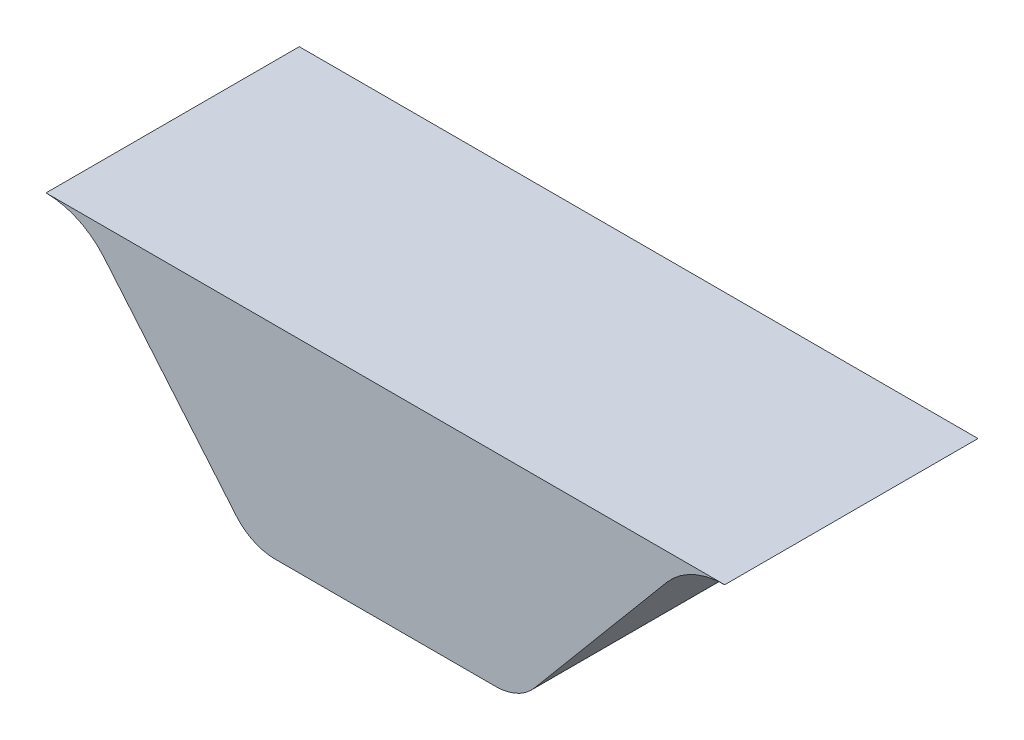
ISO-10303-21;
HEADER;
FILE_DESCRIPTION(('STEP AP214'),'2;1');
FILE_NAME('part.step','',(''),(''),'','','');
FILE_SCHEMA(('AUTOMOTIVE_DESIGN { 1 0 10303 214 1 1 1 1 }'));
ENDSEC;
DATA;
#1=APPLICATION_CONTEXT('core data for automotive mechanical design processes');
#2=APPLICATION_PROTOCOL_DEFINITION('international standard','automotive_design',2000,#1);
#3=PRODUCT_CONTEXT('',#1,'mechanical');
#4=PRODUCT('Part','Part','',(#3));
#5=PRODUCT_RELATED_PRODUCT_CATEGORY('part','',(#4));
#6=PRODUCT_DEFINITION_FORMATION('','',#4);
#7=PRODUCT_DEFINITION_CONTEXT('part definition',#1,'design');
#8=PRODUCT_DEFINITION('design','',#6,#7);
#9=PRODUCT_DEFINITION_SHAPE('','',#8);
#10=(LENGTH_UNIT() NAMED_UNIT(*) SI_UNIT(.MILLI.,.METRE.));
#11=(NAMED_UNIT(*) PLANE_ANGLE_UNIT() SI_UNIT($,.RADIAN.));
#12=(NAMED_UNIT(*) SI_UNIT($,.STERADIAN.) SOLID_ANGLE_UNIT());
#13=UNCERTAINTY_MEASURE_WITH_UNIT(LENGTH_MEASURE(1.E-05),#10,'distance_accuracy_value','');
#14=(GEOMETRIC_REPRESENTATION_CONTEXT(3) GLOBAL_UNCERTAINTY_ASSIGNED_CONTEXT((#13)) GLOBAL_UNIT_ASSIGNED_CONTEXT((#10,
#11,#12)) REPRESENTATION_CONTEXT('',''));
#15=CARTESIAN_POINT('',(0.,0.,0.));
#16=DIRECTION('',(0.,0.,1.));
#17=DIRECTION('',(1.,0.,0.));
#18=AXIS2_PLACEMENT_3D('',#15,#16,#17);
#19=CARTESIAN_POINT('',(2.64360147529084,-4.,2.5));
#20=DIRECTION('',(0.,1.,0.));
#21=DIRECTION('',(0.,0.,1.));
#22=AXIS2_PLACEMENT_3D('',#19,#20,#21);
#23=PLANE('',#22);
#24=DIRECTION('',(1.,0.,0.));
#25=VECTOR('',#24,1.);
#26=CARTESIAN_POINT('',(2.64360147529084,-4.,2.5));
#27=LINE('',#26,#25);
#28=CARTESIAN_POINT('',(-2.17729381713585,-4.,2.5));
#29=VERTEX_POINT('',#28);
#30=CARTESIAN_POINT('',(2.17729381713585,-4.,2.5));
#31=VERTEX_POINT('',#30);
#32=EDGE_CURVE('E169',#29,#31,#27,.T.);
#33=ORIENTED_EDGE('',*,*,#32,.F.);
#34=DIRECTION('',(0.,0.,-1.));
#35=VECTOR('',#34,1.);
#36=CARTESIAN_POINT('',(-2.17729381713585,-4.,2.5));
#37=LINE('',#36,#35);
#38=CARTESIAN_POINT('',(-2.17729381713585,-4.,-2.5));
#39=VERTEX_POINT('',#38);
#40=EDGE_CURVE('E155',#29,#39,#37,.T.);
#41=ORIENTED_EDGE('',*,*,#40,.T.);
#42=DIRECTION('',(1.,0.,0.));
#43=VECTOR('',#42,1.);
#44=CARTESIAN_POINT('',(2.64360147529084,-4.,-2.5));
#45=LINE('',#44,#43);
#46=CARTESIAN_POINT('',(2.17729381713585,-4.,-2.5));
#47=VERTEX_POINT('',#46);
#48=EDGE_CURVE('E161',#39,#47,#45,.T.);
#49=ORIENTED_EDGE('',*,*,#48,.T.);
#50=DIRECTION('',(0.,0.,-1.));
#51=VECTOR('',#50,1.);
#52=CARTESIAN_POINT('',(2.17729381713585,-4.,2.5));
#53=LINE('',#52,#51);
#54=EDGE_CURVE('E158',#47,#31,#53,.F.);
#55=ORIENTED_EDGE('',*,*,#54,.T.);
#56=EDGE_LOOP('',(#33,#41,#49,#55));
#57=FACE_BOUND('',#56,.T.);
#58=CARTESIAN_POINT('',(0.,-4.,0.));
#59=DIRECTION('',(0.,1.,0.));
#60=DIRECTION('',(0.,0.,1.));
#61=AXIS2_PLACEMENT_3D('',#58,#59,#60);
#62=CIRCLE('',#61,1.5);
#63=CARTESIAN_POINT('',(0.,-4.,1.5));
#64=VERTEX_POINT('',#63);
#65=EDGE_CURVE('E12',#64,#64,#62,.F.);
#66=ORIENTED_EDGE('',*,*,#65,.F.);
#67=EDGE_LOOP('',(#66));
#68=FACE_BOUND('',#67,.T.);
#69=ADVANCED_FACE('F43',(#57,#68),#23,.F.);
#70=CARTESIAN_POINT('',(-2.64360147529084,-4.,2.5));
#71=DIRECTION('',(0.766044443118974,0.642787609686544,0.));
#72=DIRECTION('',(-0.642787609686544,0.766044443118974,0.));
#73=AXIS2_PLACEMENT_3D('',#70,#71,#72);
#74=PLANE('',#73);
#75=DIRECTION('',(0.642787609686544,-0.766044443118974,0.));
#76=VECTOR('',#75,1.);
#77=CARTESIAN_POINT('',(-2.64360147529084,-4.,2.5));
#78=LINE('',#77,#76);
#79=CARTESIAN_POINT('',(-5.55039482255403,-0.535818585470184,2.5));
#80=VERTEX_POINT('',#79);
#81=CARTESIAN_POINT('',(-2.94333826025482,-3.64278760968654,2.5));
#82=VERTEX_POINT('',#81);
#83=EDGE_CURVE('E128',#80,#82,#78,.T.);
#84=ORIENTED_EDGE('',*,*,#83,.F.);
#85=DIRECTION('',(0.,0.,-1.));
#86=VECTOR('',#85,1.);
#87=CARTESIAN_POINT('',(-5.55039482255403,-0.535818585470185,-2.5));
#88=LINE('',#87,#86);
#89=CARTESIAN_POINT('',(-5.55039482255403,-0.535818585470184,-2.5));
#90=VERTEX_POINT('',#89);
#91=EDGE_CURVE('E121',#80,#90,#88,.T.);
#92=ORIENTED_EDGE('',*,*,#91,.T.);
#93=DIRECTION('',(0.642787609686544,-0.766044443118974,0.));
#94=VECTOR('',#93,1.);
#95=CARTESIAN_POINT('',(-2.64360147529084,-4.,-2.5));
#96=LINE('',#95,#94);
#97=CARTESIAN_POINT('',(-2.94333826025482,-3.64278760968654,-2.5));
#98=VERTEX_POINT('',#97);
#99=EDGE_CURVE('E164',#90,#98,#96,.T.);
#100=ORIENTED_EDGE('',*,*,#99,.T.);
#101=DIRECTION('',(0.,0.,-1.));
#102=VECTOR('',#101,1.);
#103=CARTESIAN_POINT('',(-2.94333826025482,-3.64278760968654,2.5));
#104=LINE('',#103,#102);
#105=EDGE_CURVE('E147',#98,#82,#104,.F.);
#106=ORIENTED_EDGE('',*,*,#105,.T.);
#107=EDGE_LOOP('',(#84,#92,#100,#106));
#108=FACE_BOUND('',#107,.T.);
#109=ADVANCED_FACE('F181',(#108),#74,.F.);
#110=ORIENTED_EDGE('',*,*,#65,.T.);
#111=EDGE_LOOP('',(#110));
#112=FACE_BOUND('',#111,.T.);
#113=ADVANCED_FACE('F203',(#112),#23,.F.);
#114=CARTESIAN_POINT('',(6.,0.,2.5));
#115=DIRECTION('',(-0.766044443118975,0.642787609686543,0.));
#116=DIRECTION('',(-0.642787609686543,-0.766044443118975,0.));
#117=AXIS2_PLACEMENT_3D('',#114,#115,#116);
#118=PLANE('',#117);
#119=DIRECTION('',(0.642787609686543,0.766044443118975,0.));
#120=VECTOR('',#119,1.);
#121=CARTESIAN_POINT('',(6.,0.,-2.5));
#122=LINE('',#121,#120);
#123=CARTESIAN_POINT('',(2.94333826025482,-3.64278760968654,-2.5));
#124=VERTEX_POINT('',#123);
#125=CARTESIAN_POINT('',(5.55039482255403,-0.535818585470184,-2.5));
#126=VERTEX_POINT('',#125);
#127=EDGE_CURVE('E129',#124,#126,#122,.T.);
#128=ORIENTED_EDGE('',*,*,#127,.T.);
#129=DIRECTION('',(0.,0.,-1.));
#130=VECTOR('',#129,1.);
#131=CARTESIAN_POINT('',(5.55039482255403,-0.535818585470184,2.5));
#132=LINE('',#131,#130);
#133=CARTESIAN_POINT('',(5.55039482255403,-0.535818585470184,2.5));
#134=VERTEX_POINT('',#133);
#135=EDGE_CURVE('E66',#126,#134,#132,.F.);
#136=ORIENTED_EDGE('',*,*,#135,.T.);
#137=DIRECTION('',(0.642787609686543,0.766044443118975,0.));
#138=VECTOR('',#137,1.);
#139=CARTESIAN_POINT('',(6.,0.,2.5));
#140=LINE('',#139,#138);
#141=CARTESIAN_POINT('',(2.94333826025482,-3.64278760968654,2.5));
#142=VERTEX_POINT('',#141);
#143=EDGE_CURVE('E167',#142,#134,#140,.T.);
#144=ORIENTED_EDGE('',*,*,#143,.F.);
#145=DIRECTION('',(0.,0.,-1.));
#146=VECTOR('',#145,1.);
#147=CARTESIAN_POINT('',(2.94333826025482,-3.64278760968654,2.5));
#148=LINE('',#147,#146);
#149=EDGE_CURVE('E140',#142,#124,#148,.T.);
#150=ORIENTED_EDGE('',*,*,#149,.T.);
#151=EDGE_LOOP('',(#128,#136,#144,#150));
#152=FACE_BOUND('',#151,.T.);
#153=ADVANCED_FACE('F192',(#152),#118,.F.);
#154=CARTESIAN_POINT('',(0.,0.,2.5));
#155=DIRECTION('',(0.,0.,1.));
#156=DIRECTION('',(1.,0.,0.));
#157=AXIS2_PLACEMENT_3D('',#154,#155,#156);
#158=PLANE('',#157);
#159=DIRECTION('',(-1.,0.,0.));
#160=VECTOR('',#159,1.);
#161=CARTESIAN_POINT('',(-6.,0.,2.5));
#162=LINE('',#161,#160);
#163=CARTESIAN_POINT('',(6.69946148723249,0.,2.5));
#164=VERTEX_POINT('',#163);
#165=CARTESIAN_POINT('',(-6.69946148723249,0.,2.5));
#166=VERTEX_POINT('',#165);
#167=EDGE_CURVE('E116',#164,#166,#162,.T.);
#168=ORIENTED_EDGE('',*,*,#167,.T.);
#169=CARTESIAN_POINT('',(-6.69946148723249,-1.5,2.5));
#170=DIRECTION('',(0.,0.,1.));
#171=DIRECTION('',(1.,0.,0.));
#172=AXIS2_PLACEMENT_3D('',#169,#170,#171);
#173=CIRCLE('',#172,1.5);
#174=EDGE_CURVE('E131',#166,#80,#173,.F.);
#175=ORIENTED_EDGE('',*,*,#174,.T.);
#176=ORIENTED_EDGE('',*,*,#83,.T.);
#177=CARTESIAN_POINT('',(-2.17729381713585,-3.,2.5));
#178=DIRECTION('',(0.,0.,1.));
#179=DIRECTION('',(1.,0.,0.));
#180=AXIS2_PLACEMENT_3D('',#177,#178,#179);
#181=CIRCLE('',#180,1.);
#182=EDGE_CURVE('E143',#82,#29,#181,.T.);
#183=ORIENTED_EDGE('',*,*,#182,.T.);
#184=ORIENTED_EDGE('',*,*,#32,.T.);
#185=CARTESIAN_POINT('',(2.17729381713585,-3.,2.5));
#186=DIRECTION('',(0.,0.,1.));
#187=DIRECTION('',(1.,0.,0.));
#188=AXIS2_PLACEMENT_3D('',#185,#186,#187);
#189=CIRCLE('',#188,1.);
#190=EDGE_CURVE('E145',#31,#142,#189,.T.);
#191=ORIENTED_EDGE('',*,*,#190,.T.);
#192=ORIENTED_EDGE('',*,*,#143,.T.);
#193=CARTESIAN_POINT('',(6.69946148723249,-1.5,2.5));
#194=DIRECTION('',(0.,0.,1.));
#195=DIRECTION('',(1.,0.,0.));
#196=AXIS2_PLACEMENT_3D('',#193,#194,#195);
#197=CIRCLE('',#196,1.5);
#198=EDGE_CURVE('E52',#134,#164,#197,.F.);
#199=ORIENTED_EDGE('',*,*,#198,.T.);
#200=EDGE_LOOP('',(#168,#175,#176,#183,#184,#191,#192,#199));
#201=FACE_BOUND('',#200,.T.);
#202=ADVANCED_FACE('F174',(#201),#158,.T.);
#203=CARTESIAN_POINT('',(0.,0.,-2.5));
#204=DIRECTION('',(0.,0.,1.));
#205=DIRECTION('',(1.,0.,0.));
#206=AXIS2_PLACEMENT_3D('',#203,#204,#205);
#207=PLANE('',#206);
#208=ORIENTED_EDGE('',*,*,#48,.F.);
#209=CARTESIAN_POINT('',(-2.17729381713585,-3.,-2.5));
#210=DIRECTION('',(0.,0.,1.));
#211=DIRECTION('',(1.,0.,0.));
#212=AXIS2_PLACEMENT_3D('',#209,#210,#211);
#213=CIRCLE('',#212,1.);
#214=EDGE_CURVE('E150',#39,#98,#213,.F.);
#215=ORIENTED_EDGE('',*,*,#214,.T.);
#216=ORIENTED_EDGE('',*,*,#99,.F.);
#217=CARTESIAN_POINT('',(-6.69946148723249,-1.5,-2.5));
#218=DIRECTION('',(0.,0.,1.));
#219=DIRECTION('',(1.,0.,0.));
#220=AXIS2_PLACEMENT_3D('',#217,#218,#219);
#221=CIRCLE('',#220,1.5);
#222=CARTESIAN_POINT('',(-6.69946148723249,0.,-2.5));
#223=VERTEX_POINT('',#222);
#224=EDGE_CURVE('E126',#90,#223,#221,.T.);
#225=ORIENTED_EDGE('',*,*,#224,.T.);
#226=DIRECTION('',(-1.,0.,0.));
#227=VECTOR('',#226,1.);
#228=CARTESIAN_POINT('',(-6.,0.,-2.5));
#229=LINE('',#228,#227);
#230=CARTESIAN_POINT('',(6.69946148723249,0.,-2.5));
#231=VERTEX_POINT('',#230);
#232=EDGE_CURVE('E113',#231,#223,#229,.T.);
#233=ORIENTED_EDGE('',*,*,#232,.F.);
#234=CARTESIAN_POINT('',(6.69946148723249,-1.5,-2.5));
#235=DIRECTION('',(0.,0.,1.));
#236=DIRECTION('',(1.,0.,0.));
#237=AXIS2_PLACEMENT_3D('',#234,#235,#236);
#238=CIRCLE('',#237,1.5);
#239=EDGE_CURVE('E59',#231,#126,#238,.T.);
#240=ORIENTED_EDGE('',*,*,#239,.T.);
#241=ORIENTED_EDGE('',*,*,#127,.F.);
#242=CARTESIAN_POINT('',(2.17729381713585,-3.,-2.5));
#243=DIRECTION('',(0.,0.,1.));
#244=DIRECTION('',(1.,0.,0.));
#245=AXIS2_PLACEMENT_3D('',#242,#243,#244);
#246=CIRCLE('',#245,1.);
#247=EDGE_CURVE('E153',#124,#47,#246,.F.);
#248=ORIENTED_EDGE('',*,*,#247,.T.);
#249=EDGE_LOOP('',(#208,#215,#216,#225,#233,#240,#241,#248));
#250=FACE_BOUND('',#249,.T.);
#251=ADVANCED_FACE('F124',(#250),#207,.F.);
#252=CARTESIAN_POINT('',(-2.17729381713585,-3.,2.5));
#253=DIRECTION('',(0.,0.,-1.));
#254=DIRECTION('',(-1.,0.,0.));
#255=AXIS2_PLACEMENT_3D('',#252,#253,#254);
#256=CYLINDRICAL_SURFACE('',#255,1.);
#257=ORIENTED_EDGE('',*,*,#182,.F.);
#258=ORIENTED_EDGE('',*,*,#105,.F.);
#259=ORIENTED_EDGE('',*,*,#214,.F.);
#260=ORIENTED_EDGE('',*,*,#40,.F.);
#261=EDGE_LOOP('',(#257,#258,#259,#260));
#262=FACE_BOUND('',#261,.T.);
#263=ADVANCED_FACE('F184',(#262),#256,.T.);
#264=CARTESIAN_POINT('',(2.17729381713585,-3.,2.5));
#265=DIRECTION('',(0.,0.,-1.));
#266=DIRECTION('',(-1.,0.,0.));
#267=AXIS2_PLACEMENT_3D('',#264,#265,#266);
#268=CYLINDRICAL_SURFACE('',#267,1.);
#269=ORIENTED_EDGE('',*,*,#190,.F.);
#270=ORIENTED_EDGE('',*,*,#54,.F.);
#271=ORIENTED_EDGE('',*,*,#247,.F.);
#272=ORIENTED_EDGE('',*,*,#149,.F.);
#273=EDGE_LOOP('',(#269,#270,#271,#272));
#274=FACE_BOUND('',#273,.T.);
#275=ADVANCED_FACE('F191',(#274),#268,.T.);
#276=CARTESIAN_POINT('',(-6.69946148723249,-1.5,2.5));
#277=DIRECTION('',(0.,0.,1.));
#278=DIRECTION('',(1.,0.,0.));
#279=AXIS2_PLACEMENT_3D('',#276,#277,#278);
#280=CYLINDRICAL_SURFACE('',#279,1.5);
#281=ORIENTED_EDGE('',*,*,#174,.F.);
#282=DIRECTION('',(0.,0.,-1.));
#283=VECTOR('',#282,1.);
#284=CARTESIAN_POINT('',(-6.69946148723249,0.,2.5));
#285=LINE('',#284,#283);
#286=EDGE_CURVE('E120',#223,#166,#285,.F.);
#287=ORIENTED_EDGE('',*,*,#286,.F.);
#288=ORIENTED_EDGE('',*,*,#224,.F.);
#289=ORIENTED_EDGE('',*,*,#91,.F.);
#290=EDGE_LOOP('',(#281,#287,#288,#289));
#291=FACE_BOUND('',#290,.T.);
#292=ADVANCED_FACE('F194',(#291),#280,.F.);
#293=CARTESIAN_POINT('',(6.69946148723249,-1.5,25.));
#294=DIRECTION('',(0.,0.,1.));
#295=DIRECTION('',(1.,0.,0.));
#296=AXIS2_PLACEMENT_3D('',#293,#294,#295);
#297=CYLINDRICAL_SURFACE('',#296,1.5);
#298=ORIENTED_EDGE('',*,*,#198,.F.);
#299=ORIENTED_EDGE('',*,*,#135,.F.);
#300=ORIENTED_EDGE('',*,*,#239,.F.);
#301=DIRECTION('',(0.,0.,-1.));
#302=VECTOR('',#301,1.);
#303=CARTESIAN_POINT('',(6.69946148723249,0.,-2.5));
#304=LINE('',#303,#302);
#305=EDGE_CURVE('E111',#164,#231,#304,.T.);
#306=ORIENTED_EDGE('',*,*,#305,.F.);
#307=EDGE_LOOP('',(#298,#299,#300,#306));
#308=FACE_BOUND('',#307,.T.);
#309=ADVANCED_FACE('F45',(#308),#297,.F.);
#310=CARTESIAN_POINT('',(-25.,0.,-25.));
#311=DIRECTION('',(0.,-1.,0.));
#312=DIRECTION('',(0.,0.,-1.));
#313=AXIS2_PLACEMENT_3D('',#310,#311,#312);
#314=PLANE('',#313);
#315=ORIENTED_EDGE('',*,*,#167,.F.);
#316=ORIENTED_EDGE('',*,*,#305,.T.);
#317=ORIENTED_EDGE('',*,*,#232,.T.);
#318=ORIENTED_EDGE('',*,*,#286,.T.);
#319=EDGE_LOOP('',(#315,#316,#317,#318));
#320=FACE_BOUND('',#319,.T.);
#321=ADVANCED_FACE('F112',(#320),#314,.F.);
#322=CLOSED_SHELL('',(#69,#109,#113,#153,#202,#251,#263,#275,#292,#309,#321));
#323=MANIFOLD_SOLID_BREP('B2',#322);
#324=ADVANCED_BREP_SHAPE_REPRESENTATION('',(#18,#323),#14);
#325=SHAPE_DEFINITION_REPRESENTATION(#9,#324);
ENDSEC;
END-ISO-10303-21;
